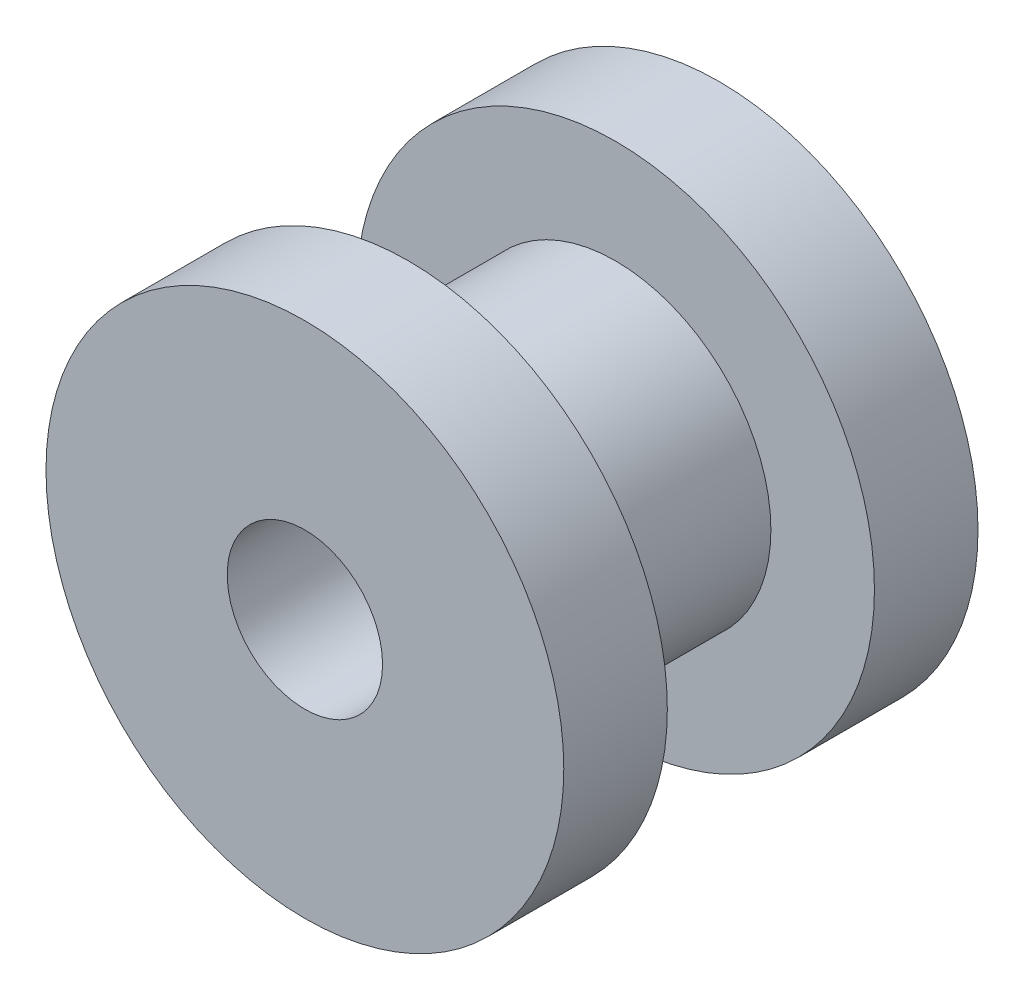
ISO-10303-21;
HEADER;
FILE_DESCRIPTION(('STEP AP214'),'2;1');
FILE_NAME('part.step','',(''),(''),'','','');
FILE_SCHEMA(('AUTOMOTIVE_DESIGN { 1 0 10303 214 1 1 1 1 }'));
ENDSEC;
DATA;
#1=APPLICATION_CONTEXT('core data for automotive mechanical design processes');
#2=APPLICATION_PROTOCOL_DEFINITION('international standard','automotive_design',2000,#1);
#3=PRODUCT_CONTEXT('',#1,'mechanical');
#4=PRODUCT('Part','Part','',(#3));
#5=PRODUCT_RELATED_PRODUCT_CATEGORY('part','',(#4));
#6=PRODUCT_DEFINITION_FORMATION('','',#4);
#7=PRODUCT_DEFINITION_CONTEXT('part definition',#1,'design');
#8=PRODUCT_DEFINITION('design','',#6,#7);
#9=PRODUCT_DEFINITION_SHAPE('','',#8);
#10=(LENGTH_UNIT() NAMED_UNIT(*) SI_UNIT(.MILLI.,.METRE.));
#11=(NAMED_UNIT(*) PLANE_ANGLE_UNIT() SI_UNIT($,.RADIAN.));
#12=(NAMED_UNIT(*) SI_UNIT($,.STERADIAN.) SOLID_ANGLE_UNIT());
#13=UNCERTAINTY_MEASURE_WITH_UNIT(LENGTH_MEASURE(1.E-05),#10,'distance_accuracy_value','');
#14=(GEOMETRIC_REPRESENTATION_CONTEXT(3) GLOBAL_UNCERTAINTY_ASSIGNED_CONTEXT((#13)) GLOBAL_UNIT_ASSIGNED_CONTEXT((#10,
#11,#12)) REPRESENTATION_CONTEXT('',''));
#15=CARTESIAN_POINT('',(0.,0.,0.));
#16=DIRECTION('',(0.,0.,1.));
#17=DIRECTION('',(1.,0.,0.));
#18=AXIS2_PLACEMENT_3D('',#15,#16,#17);
#19=CARTESIAN_POINT('',(0.,0.,1.));
#20=DIRECTION('',(0.,0.,-1.));
#21=DIRECTION('',(-1.,0.,0.));
#22=AXIS2_PLACEMENT_3D('',#19,#20,#21);
#23=CYLINDRICAL_SURFACE('',#22,1.5);
#24=CARTESIAN_POINT('',(0.,0.,1.));
#25=DIRECTION('',(0.,0.,1.));
#26=DIRECTION('',(1.,0.,0.));
#27=AXIS2_PLACEMENT_3D('',#24,#25,#26);
#28=CIRCLE('',#27,1.5);
#29=CARTESIAN_POINT('',(1.5,0.,1.));
#30=VERTEX_POINT('',#29);
#31=EDGE_CURVE('E10',#30,#30,#28,.T.);
#32=ORIENTED_EDGE('',*,*,#31,.F.);
#33=EDGE_LOOP('',(#32));
#34=FACE_BOUND('',#33,.T.);
#35=CARTESIAN_POINT('',(0.,0.,-1.));
#36=DIRECTION('',(0.,0.,1.));
#37=DIRECTION('',(1.,0.,0.));
#38=AXIS2_PLACEMENT_3D('',#35,#36,#37);
#39=CIRCLE('',#38,1.5);
#40=CARTESIAN_POINT('',(1.5,0.,-1.));
#41=VERTEX_POINT('',#40);
#42=EDGE_CURVE('E40',#41,#41,#39,.T.);
#43=ORIENTED_EDGE('',*,*,#42,.T.);
#44=EDGE_LOOP('',(#43));
#45=FACE_BOUND('',#44,.T.);
#46=ADVANCED_FACE('F37',(#34,#45),#23,.T.);
#47=CARTESIAN_POINT('',(0.,0.,2.));
#48=DIRECTION('',(0.,0.,-1.));
#49=DIRECTION('',(-1.,0.,0.));
#50=AXIS2_PLACEMENT_3D('',#47,#48,#49);
#51=CYLINDRICAL_SURFACE('',#50,2.5);
#52=CARTESIAN_POINT('',(0.,0.,2.));
#53=DIRECTION('',(0.,0.,1.));
#54=DIRECTION('',(1.,0.,0.));
#55=AXIS2_PLACEMENT_3D('',#52,#53,#54);
#56=CIRCLE('',#55,2.5);
#57=CARTESIAN_POINT('',(2.5,0.,2.));
#58=VERTEX_POINT('',#57);
#59=EDGE_CURVE('E44',#58,#58,#56,.T.);
#60=ORIENTED_EDGE('',*,*,#59,.F.);
#61=EDGE_LOOP('',(#60));
#62=FACE_BOUND('',#61,.T.);
#63=CARTESIAN_POINT('',(0.,0.,1.));
#64=DIRECTION('',(0.,0.,1.));
#65=DIRECTION('',(1.,0.,0.));
#66=AXIS2_PLACEMENT_3D('',#63,#64,#65);
#67=CIRCLE('',#66,2.5);
#68=CARTESIAN_POINT('',(2.5,0.,1.));
#69=VERTEX_POINT('',#68);
#70=EDGE_CURVE('E48',#69,#69,#67,.T.);
#71=ORIENTED_EDGE('',*,*,#70,.T.);
#72=EDGE_LOOP('',(#71));
#73=FACE_BOUND('',#72,.T.);
#74=ADVANCED_FACE('F80',(#62,#73),#51,.T.);
#75=CARTESIAN_POINT('',(0.,0.,2.));
#76=DIRECTION('',(0.,0.,1.));
#77=DIRECTION('',(1.,0.,0.));
#78=AXIS2_PLACEMENT_3D('',#75,#76,#77);
#79=PLANE('',#78);
#80=CARTESIAN_POINT('',(0.,0.,2.));
#81=DIRECTION('',(0.,0.,1.));
#82=DIRECTION('',(1.,0.,0.));
#83=AXIS2_PLACEMENT_3D('',#80,#81,#82);
#84=CIRCLE('',#83,0.75);
#85=CARTESIAN_POINT('',(0.75,0.,2.));
#86=VERTEX_POINT('',#85);
#87=EDGE_CURVE('E60',#86,#86,#84,.T.);
#88=ORIENTED_EDGE('',*,*,#87,.F.);
#89=EDGE_LOOP('',(#88));
#90=FACE_BOUND('',#89,.T.);
#91=ORIENTED_EDGE('',*,*,#59,.T.);
#92=EDGE_LOOP('',(#91));
#93=FACE_BOUND('',#92,.T.);
#94=ADVANCED_FACE('F76',(#90,#93),#79,.T.);
#95=CARTESIAN_POINT('',(0.,0.,1.));
#96=DIRECTION('',(0.,0.,1.));
#97=DIRECTION('',(1.,0.,0.));
#98=AXIS2_PLACEMENT_3D('',#95,#96,#97);
#99=PLANE('',#98);
#100=ORIENTED_EDGE('',*,*,#31,.T.);
#101=EDGE_LOOP('',(#100));
#102=FACE_BOUND('',#101,.T.);
#103=ORIENTED_EDGE('',*,*,#70,.F.);
#104=EDGE_LOOP('',(#103));
#105=FACE_BOUND('',#104,.T.);
#106=ADVANCED_FACE('F79',(#102,#105),#99,.F.);
#107=CARTESIAN_POINT('',(0.,0.,-2.));
#108=DIRECTION('',(0.,0.,1.));
#109=DIRECTION('',(1.,0.,0.));
#110=AXIS2_PLACEMENT_3D('',#107,#108,#109);
#111=CYLINDRICAL_SURFACE('',#110,2.5);
#112=CARTESIAN_POINT('',(0.,0.,-2.));
#113=DIRECTION('',(0.,0.,1.));
#114=DIRECTION('',(1.,0.,0.));
#115=AXIS2_PLACEMENT_3D('',#112,#113,#114);
#116=CIRCLE('',#115,2.5);
#117=CARTESIAN_POINT('',(2.5,0.,-2.));
#118=VERTEX_POINT('',#117);
#119=EDGE_CURVE('E56',#118,#118,#116,.T.);
#120=ORIENTED_EDGE('',*,*,#119,.T.);
#121=EDGE_LOOP('',(#120));
#122=FACE_BOUND('',#121,.T.);
#123=CARTESIAN_POINT('',(0.,0.,-1.));
#124=DIRECTION('',(0.,0.,1.));
#125=DIRECTION('',(1.,0.,0.));
#126=AXIS2_PLACEMENT_3D('',#123,#124,#125);
#127=CIRCLE('',#126,2.5);
#128=CARTESIAN_POINT('',(2.5,0.,-1.));
#129=VERTEX_POINT('',#128);
#130=EDGE_CURVE('E53',#129,#129,#127,.T.);
#131=ORIENTED_EDGE('',*,*,#130,.F.);
#132=EDGE_LOOP('',(#131));
#133=FACE_BOUND('',#132,.T.);
#134=ADVANCED_FACE('F89',(#122,#133),#111,.T.);
#135=CARTESIAN_POINT('',(0.,0.,-2.));
#136=DIRECTION('',(0.,0.,-1.));
#137=DIRECTION('',(1.,0.,0.));
#138=AXIS2_PLACEMENT_3D('',#135,#136,#137);
#139=PLANE('',#138);
#140=CARTESIAN_POINT('',(0.,0.,-2.));
#141=DIRECTION('',(0.,0.,1.));
#142=DIRECTION('',(1.,0.,0.));
#143=AXIS2_PLACEMENT_3D('',#140,#141,#142);
#144=CIRCLE('',#143,0.75);
#145=CARTESIAN_POINT('',(0.75,0.,-2.));
#146=VERTEX_POINT('',#145);
#147=EDGE_CURVE('E57',#146,#146,#144,.T.);
#148=ORIENTED_EDGE('',*,*,#147,.T.);
#149=EDGE_LOOP('',(#148));
#150=FACE_BOUND('',#149,.T.);
#151=ORIENTED_EDGE('',*,*,#119,.F.);
#152=EDGE_LOOP('',(#151));
#153=FACE_BOUND('',#152,.T.);
#154=ADVANCED_FACE('F66',(#150,#153),#139,.T.);
#155=CARTESIAN_POINT('',(0.,0.,-1.));
#156=DIRECTION('',(0.,0.,-1.));
#157=DIRECTION('',(1.,0.,0.));
#158=AXIS2_PLACEMENT_3D('',#155,#156,#157);
#159=PLANE('',#158);
#160=ORIENTED_EDGE('',*,*,#42,.F.);
#161=EDGE_LOOP('',(#160));
#162=FACE_BOUND('',#161,.T.);
#163=ORIENTED_EDGE('',*,*,#130,.T.);
#164=EDGE_LOOP('',(#163));
#165=FACE_BOUND('',#164,.T.);
#166=ADVANCED_FACE('F72',(#162,#165),#159,.F.);
#167=CARTESIAN_POINT('',(0.,0.,-2.));
#168=DIRECTION('',(0.,0.,1.));
#169=DIRECTION('',(1.,0.,0.));
#170=AXIS2_PLACEMENT_3D('',#167,#168,#169);
#171=CYLINDRICAL_SURFACE('',#170,0.75);
#172=ORIENTED_EDGE('',*,*,#147,.F.);
#173=EDGE_LOOP('',(#172));
#174=FACE_BOUND('',#173,.T.);
#175=ORIENTED_EDGE('',*,*,#87,.T.);
#176=EDGE_LOOP('',(#175));
#177=FACE_BOUND('',#176,.T.);
#178=ADVANCED_FACE('F69',(#174,#177),#171,.F.);
#179=CLOSED_SHELL('',(#46,#74,#94,#106,#134,#154,#166,#178));
#180=MANIFOLD_SOLID_BREP('B2',#179);
#181=ADVANCED_BREP_SHAPE_REPRESENTATION('',(#18,#180),#14);
#182=SHAPE_DEFINITION_REPRESENTATION(#9,#181);
ENDSEC;
END-ISO-10303-21;
